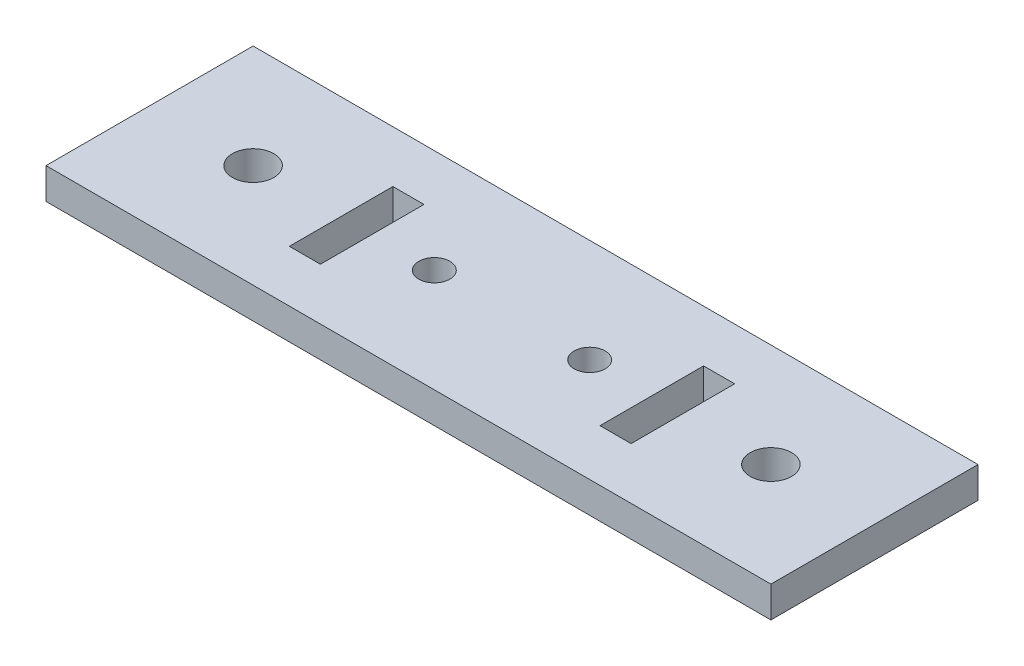
ISO-10303-21;
HEADER;
FILE_DESCRIPTION(('STEP AP214'),'2;1');
FILE_NAME('part.step','',(''),(''),'','','');
FILE_SCHEMA(('AUTOMOTIVE_DESIGN { 1 0 10303 214 1 1 1 1 }'));
ENDSEC;
DATA;
#1=APPLICATION_CONTEXT('core data for automotive mechanical design processes');
#2=APPLICATION_PROTOCOL_DEFINITION('international standard','automotive_design',2000,#1);
#3=PRODUCT_CONTEXT('',#1,'mechanical');
#4=PRODUCT('Part','Part','',(#3));
#5=PRODUCT_RELATED_PRODUCT_CATEGORY('part','',(#4));
#6=PRODUCT_DEFINITION_FORMATION('','',#4);
#7=PRODUCT_DEFINITION_CONTEXT('part definition',#1,'design');
#8=PRODUCT_DEFINITION('design','',#6,#7);
#9=PRODUCT_DEFINITION_SHAPE('','',#8);
#10=(LENGTH_UNIT() NAMED_UNIT(*) SI_UNIT(.MILLI.,.METRE.));
#11=(NAMED_UNIT(*) PLANE_ANGLE_UNIT() SI_UNIT($,.RADIAN.));
#12=(NAMED_UNIT(*) SI_UNIT($,.STERADIAN.) SOLID_ANGLE_UNIT());
#13=UNCERTAINTY_MEASURE_WITH_UNIT(LENGTH_MEASURE(1.E-05),#10,'distance_accuracy_value','');
#14=(GEOMETRIC_REPRESENTATION_CONTEXT(3) GLOBAL_UNCERTAINTY_ASSIGNED_CONTEXT((#13)) GLOBAL_UNIT_ASSIGNED_CONTEXT((#10,
#11,#12)) REPRESENTATION_CONTEXT('',''));
#15=CARTESIAN_POINT('',(0.,0.,0.));
#16=DIRECTION('',(0.,0.,1.));
#17=DIRECTION('',(1.,0.,0.));
#18=AXIS2_PLACEMENT_3D('',#15,#16,#17);
#19=CARTESIAN_POINT('',(0.,3.,0.));
#20=DIRECTION('',(0.,-1.,0.));
#21=DIRECTION('',(0.,0.,-1.));
#22=AXIS2_PLACEMENT_3D('',#19,#20,#21);
#23=PLANE('',#22);
#24=DIRECTION('',(0.,0.,1.));
#25=VECTOR('',#24,1.);
#26=CARTESIAN_POINT('',(18.5,3.,-15.));
#27=LINE('',#26,#25);
#28=CARTESIAN_POINT('',(18.5,3.,-15.));
#29=VERTEX_POINT('',#28);
#30=CARTESIAN_POINT('',(18.5,3.,-5.));
#31=VERTEX_POINT('',#30);
#32=EDGE_CURVE('E186',#29,#31,#27,.T.);
#33=ORIENTED_EDGE('',*,*,#32,.F.);
#34=DIRECTION('',(-1.,0.,0.));
#35=VECTOR('',#34,1.);
#36=CARTESIAN_POINT('',(18.5,3.,-15.));
#37=LINE('',#36,#35);
#38=CARTESIAN_POINT('',(21.5,3.,-15.));
#39=VERTEX_POINT('',#38);
#40=EDGE_CURVE('E197',#39,#29,#37,.T.);
#41=ORIENTED_EDGE('',*,*,#40,.F.);
#42=DIRECTION('',(0.,0.,-1.));
#43=VECTOR('',#42,1.);
#44=CARTESIAN_POINT('',(21.5,3.,-15.));
#45=LINE('',#44,#43);
#46=CARTESIAN_POINT('',(21.5,3.,-5.));
#47=VERTEX_POINT('',#46);
#48=EDGE_CURVE('E193',#47,#39,#45,.T.);
#49=ORIENTED_EDGE('',*,*,#48,.F.);
#50=DIRECTION('',(1.,0.,0.));
#51=VECTOR('',#50,1.);
#52=CARTESIAN_POINT('',(18.5,3.,-5.));
#53=LINE('',#52,#51);
#54=EDGE_CURVE('E189',#31,#47,#53,.T.);
#55=ORIENTED_EDGE('',*,*,#54,.F.);
#56=EDGE_LOOP('',(#33,#41,#49,#55));
#57=FACE_BOUND('',#56,.T.);
#58=DIRECTION('',(0.,0.,1.));
#59=VECTOR('',#58,1.);
#60=CARTESIAN_POINT('',(0.,3.,0.));
#61=LINE('',#60,#59);
#62=CARTESIAN_POINT('',(0.,3.,-20.));
#63=VERTEX_POINT('',#62);
#64=CARTESIAN_POINT('',(0.,3.,0.));
#65=VERTEX_POINT('',#64);
#66=EDGE_CURVE('E229',#63,#65,#61,.T.);
#67=ORIENTED_EDGE('',*,*,#66,.T.);
#68=DIRECTION('',(1.,0.,0.));
#69=VECTOR('',#68,1.);
#70=CARTESIAN_POINT('',(0.,3.,0.));
#71=LINE('',#70,#69);
#72=CARTESIAN_POINT('',(70.,3.,0.));
#73=VERTEX_POINT('',#72);
#74=EDGE_CURVE('E233',#65,#73,#71,.T.);
#75=ORIENTED_EDGE('',*,*,#74,.T.);
#76=DIRECTION('',(0.,0.,-1.));
#77=VECTOR('',#76,1.);
#78=CARTESIAN_POINT('',(70.,3.,0.));
#79=LINE('',#78,#77);
#80=CARTESIAN_POINT('',(70.,3.,-20.));
#81=VERTEX_POINT('',#80);
#82=EDGE_CURVE('E237',#73,#81,#79,.T.);
#83=ORIENTED_EDGE('',*,*,#82,.T.);
#84=DIRECTION('',(-1.,0.,0.));
#85=VECTOR('',#84,1.);
#86=CARTESIAN_POINT('',(0.,3.,-20.));
#87=LINE('',#86,#85);
#88=EDGE_CURVE('E240',#81,#63,#87,.T.);
#89=ORIENTED_EDGE('',*,*,#88,.T.);
#90=EDGE_LOOP('',(#67,#75,#83,#89));
#91=FACE_BOUND('',#90,.T.);
#92=DIRECTION('',(0.,0.,-1.));
#93=VECTOR('',#92,1.);
#94=CARTESIAN_POINT('',(51.5,3.,-15.));
#95=LINE('',#94,#93);
#96=CARTESIAN_POINT('',(51.5,3.,-5.00000000000002));
#97=VERTEX_POINT('',#96);
#98=CARTESIAN_POINT('',(51.5,3.,-15.));
#99=VERTEX_POINT('',#98);
#100=EDGE_CURVE('E135',#97,#99,#95,.T.);
#101=ORIENTED_EDGE('',*,*,#100,.F.);
#102=DIRECTION('',(1.,0.,0.));
#103=VECTOR('',#102,1.);
#104=CARTESIAN_POINT('',(51.5,3.,-5.00000000000002));
#105=LINE('',#104,#103);
#106=CARTESIAN_POINT('',(48.5,3.,-5.00000000000002));
#107=VERTEX_POINT('',#106);
#108=EDGE_CURVE('E162',#107,#97,#105,.T.);
#109=ORIENTED_EDGE('',*,*,#108,.F.);
#110=DIRECTION('',(0.,0.,1.));
#111=VECTOR('',#110,1.);
#112=CARTESIAN_POINT('',(48.5,3.,-15.));
#113=LINE('',#112,#111);
#114=CARTESIAN_POINT('',(48.5,3.,-15.));
#115=VERTEX_POINT('',#114);
#116=EDGE_CURVE('E158',#115,#107,#113,.T.);
#117=ORIENTED_EDGE('',*,*,#116,.F.);
#118=DIRECTION('',(-1.,0.,0.));
#119=VECTOR('',#118,1.);
#120=CARTESIAN_POINT('',(51.5,3.,-15.));
#121=LINE('',#120,#119);
#122=EDGE_CURVE('E144',#99,#115,#121,.T.);
#123=ORIENTED_EDGE('',*,*,#122,.F.);
#124=EDGE_LOOP('',(#101,#109,#117,#123));
#125=FACE_BOUND('',#124,.T.);
#126=CARTESIAN_POINT('',(10.,3.,-10.));
#127=DIRECTION('',(0.,1.,0.));
#128=DIRECTION('',(0.,0.,1.));
#129=AXIS2_PLACEMENT_3D('',#126,#127,#128);
#130=CIRCLE('',#129,2.);
#131=CARTESIAN_POINT('',(10.,3.,-8.));
#132=VERTEX_POINT('',#131);
#133=EDGE_CURVE('E170',#132,#132,#130,.T.);
#134=ORIENTED_EDGE('',*,*,#133,.F.);
#135=EDGE_LOOP('',(#134));
#136=FACE_BOUND('',#135,.T.);
#137=CARTESIAN_POINT('',(27.5,3.,-9.99999999999999));
#138=DIRECTION('',(0.,1.,0.));
#139=DIRECTION('',(0.,0.,1.));
#140=AXIS2_PLACEMENT_3D('',#137,#138,#139);
#141=CIRCLE('',#140,1.5);
#142=CARTESIAN_POINT('',(27.5,3.,-8.49999999999999));
#143=VERTEX_POINT('',#142);
#144=EDGE_CURVE('E383',#143,#143,#141,.T.);
#145=ORIENTED_EDGE('',*,*,#144,.F.);
#146=EDGE_LOOP('',(#145));
#147=FACE_BOUND('',#146,.T.);
#148=CARTESIAN_POINT('',(60.,3.,-10.));
#149=DIRECTION('',(0.,1.,0.));
#150=DIRECTION('',(0.,0.,-1.));
#151=AXIS2_PLACEMENT_3D('',#148,#149,#150);
#152=CIRCLE('',#151,2.);
#153=CARTESIAN_POINT('',(60.,3.,-12.));
#154=VERTEX_POINT('',#153);
#155=EDGE_CURVE('E375',#154,#154,#152,.T.);
#156=ORIENTED_EDGE('',*,*,#155,.F.);
#157=EDGE_LOOP('',(#156));
#158=FACE_BOUND('',#157,.T.);
#159=CARTESIAN_POINT('',(42.5,3.,-10.));
#160=DIRECTION('',(0.,1.,0.));
#161=DIRECTION('',(0.,0.,-1.));
#162=AXIS2_PLACEMENT_3D('',#159,#160,#161);
#163=CIRCLE('',#162,1.5);
#164=CARTESIAN_POINT('',(42.5,3.,-11.5));
#165=VERTEX_POINT('',#164);
#166=EDGE_CURVE('E364',#165,#165,#163,.T.);
#167=ORIENTED_EDGE('',*,*,#166,.F.);
#168=EDGE_LOOP('',(#167));
#169=FACE_BOUND('',#168,.T.);
#170=ADVANCED_FACE('F45',(#57,#91,#125,#136,#147,#158,#169),#23,.F.);
#171=CARTESIAN_POINT('',(0.,0.,0.));
#172=DIRECTION('',(0.,-1.,0.));
#173=DIRECTION('',(0.,0.,-1.));
#174=AXIS2_PLACEMENT_3D('',#171,#172,#173);
#175=PLANE('',#174);
#176=CARTESIAN_POINT('',(60.,0.,-10.));
#177=DIRECTION('',(0.,1.,0.));
#178=DIRECTION('',(0.,0.,-1.));
#179=AXIS2_PLACEMENT_3D('',#176,#177,#178);
#180=CIRCLE('',#179,2.);
#181=CARTESIAN_POINT('',(60.,0.,-12.));
#182=VERTEX_POINT('',#181);
#183=EDGE_CURVE('E372',#182,#182,#180,.T.);
#184=ORIENTED_EDGE('',*,*,#183,.T.);
#185=EDGE_LOOP('',(#184));
#186=FACE_BOUND('',#185,.T.);
#187=CARTESIAN_POINT('',(10.,0.,-10.));
#188=DIRECTION('',(0.,1.,0.));
#189=DIRECTION('',(0.,0.,1.));
#190=AXIS2_PLACEMENT_3D('',#187,#188,#189);
#191=CIRCLE('',#190,2.);
#192=CARTESIAN_POINT('',(10.,0.,-8.));
#193=VERTEX_POINT('',#192);
#194=EDGE_CURVE('E387',#193,#193,#191,.T.);
#195=ORIENTED_EDGE('',*,*,#194,.T.);
#196=EDGE_LOOP('',(#195));
#197=FACE_BOUND('',#196,.T.);
#198=DIRECTION('',(0.,0.,1.));
#199=VECTOR('',#198,1.);
#200=CARTESIAN_POINT('',(0.,0.,0.));
#201=LINE('',#200,#199);
#202=CARTESIAN_POINT('',(0.,0.,-20.));
#203=VERTEX_POINT('',#202);
#204=CARTESIAN_POINT('',(0.,0.,0.));
#205=VERTEX_POINT('',#204);
#206=EDGE_CURVE('E228',#203,#205,#201,.T.);
#207=ORIENTED_EDGE('',*,*,#206,.F.);
#208=DIRECTION('',(-1.,0.,0.));
#209=VECTOR('',#208,1.);
#210=CARTESIAN_POINT('',(0.,0.,-20.));
#211=LINE('',#210,#209);
#212=CARTESIAN_POINT('',(70.,0.,-20.));
#213=VERTEX_POINT('',#212);
#214=EDGE_CURVE('E234',#213,#203,#211,.T.);
#215=ORIENTED_EDGE('',*,*,#214,.F.);
#216=DIRECTION('',(0.,0.,-1.));
#217=VECTOR('',#216,1.);
#218=CARTESIAN_POINT('',(70.,0.,0.));
#219=LINE('',#218,#217);
#220=CARTESIAN_POINT('',(70.,0.,0.));
#221=VERTEX_POINT('',#220);
#222=EDGE_CURVE('E250',#221,#213,#219,.T.);
#223=ORIENTED_EDGE('',*,*,#222,.F.);
#224=DIRECTION('',(1.,0.,0.));
#225=VECTOR('',#224,1.);
#226=CARTESIAN_POINT('',(0.,0.,0.));
#227=LINE('',#226,#225);
#228=EDGE_CURVE('E247',#205,#221,#227,.T.);
#229=ORIENTED_EDGE('',*,*,#228,.F.);
#230=EDGE_LOOP('',(#207,#215,#223,#229));
#231=FACE_BOUND('',#230,.T.);
#232=DIRECTION('',(-1.,0.,0.));
#233=VECTOR('',#232,1.);
#234=CARTESIAN_POINT('',(18.5,0.,-15.));
#235=LINE('',#234,#233);
#236=CARTESIAN_POINT('',(21.5,0.,-15.));
#237=VERTEX_POINT('',#236);
#238=CARTESIAN_POINT('',(18.5,0.,-15.));
#239=VERTEX_POINT('',#238);
#240=EDGE_CURVE('E190',#237,#239,#235,.T.);
#241=ORIENTED_EDGE('',*,*,#240,.T.);
#242=DIRECTION('',(0.,0.,1.));
#243=VECTOR('',#242,1.);
#244=CARTESIAN_POINT('',(18.5,0.,-15.));
#245=LINE('',#244,#243);
#246=CARTESIAN_POINT('',(18.5,0.,-5.));
#247=VERTEX_POINT('',#246);
#248=EDGE_CURVE('E153',#239,#247,#245,.T.);
#249=ORIENTED_EDGE('',*,*,#248,.T.);
#250=DIRECTION('',(1.,0.,0.));
#251=VECTOR('',#250,1.);
#252=CARTESIAN_POINT('',(18.5,0.,-5.));
#253=LINE('',#252,#251);
#254=CARTESIAN_POINT('',(21.5,0.,-5.));
#255=VERTEX_POINT('',#254);
#256=EDGE_CURVE('E204',#247,#255,#253,.T.);
#257=ORIENTED_EDGE('',*,*,#256,.T.);
#258=DIRECTION('',(0.,0.,-1.));
#259=VECTOR('',#258,1.);
#260=CARTESIAN_POINT('',(21.5,0.,-15.));
#261=LINE('',#260,#259);
#262=EDGE_CURVE('E208',#255,#237,#261,.T.);
#263=ORIENTED_EDGE('',*,*,#262,.T.);
#264=EDGE_LOOP('',(#241,#249,#257,#263));
#265=FACE_BOUND('',#264,.T.);
#266=DIRECTION('',(1.,0.,0.));
#267=VECTOR('',#266,1.);
#268=CARTESIAN_POINT('',(51.5,0.,-5.00000000000002));
#269=LINE('',#268,#267);
#270=CARTESIAN_POINT('',(48.5,0.,-5.00000000000002));
#271=VERTEX_POINT('',#270);
#272=CARTESIAN_POINT('',(51.5,0.,-5.00000000000002));
#273=VERTEX_POINT('',#272);
#274=EDGE_CURVE('E145',#271,#273,#269,.T.);
#275=ORIENTED_EDGE('',*,*,#274,.T.);
#276=DIRECTION('',(0.,0.,-1.));
#277=VECTOR('',#276,1.);
#278=CARTESIAN_POINT('',(51.5,0.,-15.));
#279=LINE('',#278,#277);
#280=CARTESIAN_POINT('',(51.5,0.,-15.));
#281=VERTEX_POINT('',#280);
#282=EDGE_CURVE('E69',#273,#281,#279,.T.);
#283=ORIENTED_EDGE('',*,*,#282,.T.);
#284=DIRECTION('',(-1.,0.,0.));
#285=VECTOR('',#284,1.);
#286=CARTESIAN_POINT('',(51.5,0.,-15.));
#287=LINE('',#286,#285);
#288=CARTESIAN_POINT('',(48.5,0.,-15.));
#289=VERTEX_POINT('',#288);
#290=EDGE_CURVE('E151',#281,#289,#287,.T.);
#291=ORIENTED_EDGE('',*,*,#290,.T.);
#292=DIRECTION('',(0.,0.,1.));
#293=VECTOR('',#292,1.);
#294=CARTESIAN_POINT('',(48.5,0.,-15.));
#295=LINE('',#294,#293);
#296=EDGE_CURVE('E173',#289,#271,#295,.T.);
#297=ORIENTED_EDGE('',*,*,#296,.T.);
#298=EDGE_LOOP('',(#275,#283,#291,#297));
#299=FACE_BOUND('',#298,.T.);
#300=CARTESIAN_POINT('',(27.5,0.,-9.99999999999999));
#301=DIRECTION('',(0.,1.,0.));
#302=DIRECTION('',(0.,0.,1.));
#303=AXIS2_PLACEMENT_3D('',#300,#301,#302);
#304=CIRCLE('',#303,1.5);
#305=CARTESIAN_POINT('',(27.5,0.,-8.49999999999999));
#306=VERTEX_POINT('',#305);
#307=EDGE_CURVE('E379',#306,#306,#304,.T.);
#308=ORIENTED_EDGE('',*,*,#307,.T.);
#309=EDGE_LOOP('',(#308));
#310=FACE_BOUND('',#309,.T.);
#311=CARTESIAN_POINT('',(42.5,0.,-10.));
#312=DIRECTION('',(0.,1.,0.));
#313=DIRECTION('',(0.,0.,-1.));
#314=AXIS2_PLACEMENT_3D('',#311,#312,#313);
#315=CIRCLE('',#314,1.5);
#316=CARTESIAN_POINT('',(42.5,0.,-11.5));
#317=VERTEX_POINT('',#316);
#318=EDGE_CURVE('E367',#317,#317,#315,.T.);
#319=ORIENTED_EDGE('',*,*,#318,.T.);
#320=EDGE_LOOP('',(#319));
#321=FACE_BOUND('',#320,.T.);
#322=ADVANCED_FACE('F273',(#186,#197,#231,#265,#299,#310,#321),#175,.T.);
#323=CARTESIAN_POINT('',(0.,3.,0.));
#324=DIRECTION('',(1.,0.,0.));
#325=DIRECTION('',(0.,0.,-1.));
#326=AXIS2_PLACEMENT_3D('',#323,#324,#325);
#327=PLANE('',#326);
#328=ORIENTED_EDGE('',*,*,#206,.T.);
#329=DIRECTION('',(0.,-1.,0.));
#330=VECTOR('',#329,1.);
#331=CARTESIAN_POINT('',(0.,3.,0.));
#332=LINE('',#331,#330);
#333=EDGE_CURVE('E11',#65,#205,#332,.T.);
#334=ORIENTED_EDGE('',*,*,#333,.F.);
#335=ORIENTED_EDGE('',*,*,#66,.F.);
#336=DIRECTION('',(0.,-1.,0.));
#337=VECTOR('',#336,1.);
#338=CARTESIAN_POINT('',(0.,3.,-20.));
#339=LINE('',#338,#337);
#340=EDGE_CURVE('E243',#63,#203,#339,.T.);
#341=ORIENTED_EDGE('',*,*,#340,.T.);
#342=EDGE_LOOP('',(#328,#334,#335,#341));
#343=FACE_BOUND('',#342,.T.);
#344=ADVANCED_FACE('F47',(#343),#327,.F.);
#345=CARTESIAN_POINT('',(0.,3.,0.));
#346=DIRECTION('',(0.,0.,-1.));
#347=DIRECTION('',(-1.,0.,0.));
#348=AXIS2_PLACEMENT_3D('',#345,#346,#347);
#349=PLANE('',#348);
#350=ORIENTED_EDGE('',*,*,#228,.T.);
#351=DIRECTION('',(0.,-1.,0.));
#352=VECTOR('',#351,1.);
#353=CARTESIAN_POINT('',(70.,3.,0.));
#354=LINE('',#353,#352);
#355=EDGE_CURVE('E54',#73,#221,#354,.T.);
#356=ORIENTED_EDGE('',*,*,#355,.F.);
#357=ORIENTED_EDGE('',*,*,#74,.F.);
#358=ORIENTED_EDGE('',*,*,#333,.T.);
#359=EDGE_LOOP('',(#350,#356,#357,#358));
#360=FACE_BOUND('',#359,.T.);
#361=ADVANCED_FACE('F283',(#360),#349,.F.);
#362=CARTESIAN_POINT('',(70.,3.,0.));
#363=DIRECTION('',(-1.,0.,0.));
#364=DIRECTION('',(0.,0.,1.));
#365=AXIS2_PLACEMENT_3D('',#362,#363,#364);
#366=PLANE('',#365);
#367=ORIENTED_EDGE('',*,*,#222,.T.);
#368=DIRECTION('',(0.,-1.,0.));
#369=VECTOR('',#368,1.);
#370=CARTESIAN_POINT('',(70.,3.,-20.));
#371=LINE('',#370,#369);
#372=EDGE_CURVE('E258',#81,#213,#371,.T.);
#373=ORIENTED_EDGE('',*,*,#372,.F.);
#374=ORIENTED_EDGE('',*,*,#82,.F.);
#375=ORIENTED_EDGE('',*,*,#355,.T.);
#376=EDGE_LOOP('',(#367,#373,#374,#375));
#377=FACE_BOUND('',#376,.T.);
#378=ADVANCED_FACE('F267',(#377),#366,.F.);
#379=CARTESIAN_POINT('',(0.,3.,-20.));
#380=DIRECTION('',(0.,0.,1.));
#381=DIRECTION('',(1.,0.,0.));
#382=AXIS2_PLACEMENT_3D('',#379,#380,#381);
#383=PLANE('',#382);
#384=ORIENTED_EDGE('',*,*,#214,.T.);
#385=ORIENTED_EDGE('',*,*,#340,.F.);
#386=ORIENTED_EDGE('',*,*,#88,.F.);
#387=ORIENTED_EDGE('',*,*,#372,.T.);
#388=EDGE_LOOP('',(#384,#385,#386,#387));
#389=FACE_BOUND('',#388,.T.);
#390=ADVANCED_FACE('F277',(#389),#383,.F.);
#391=CARTESIAN_POINT('',(18.5,3.,-15.));
#392=DIRECTION('',(1.,0.,0.));
#393=DIRECTION('',(0.,0.,-1.));
#394=AXIS2_PLACEMENT_3D('',#391,#392,#393);
#395=PLANE('',#394);
#396=ORIENTED_EDGE('',*,*,#248,.F.);
#397=DIRECTION('',(0.,-1.,0.));
#398=VECTOR('',#397,1.);
#399=CARTESIAN_POINT('',(18.5,3.,-15.));
#400=LINE('',#399,#398);
#401=EDGE_CURVE('E200',#29,#239,#400,.T.);
#402=ORIENTED_EDGE('',*,*,#401,.F.);
#403=ORIENTED_EDGE('',*,*,#32,.T.);
#404=DIRECTION('',(0.,-1.,0.));
#405=VECTOR('',#404,1.);
#406=CARTESIAN_POINT('',(18.5,3.,-5.));
#407=LINE('',#406,#405);
#408=EDGE_CURVE('E224',#31,#247,#407,.T.);
#409=ORIENTED_EDGE('',*,*,#408,.T.);
#410=EDGE_LOOP('',(#396,#402,#403,#409));
#411=FACE_BOUND('',#410,.T.);
#412=ADVANCED_FACE('F300',(#411),#395,.T.);
#413=CARTESIAN_POINT('',(18.5,3.,-5.));
#414=DIRECTION('',(0.,0.,-1.));
#415=DIRECTION('',(-1.,0.,0.));
#416=AXIS2_PLACEMENT_3D('',#413,#414,#415);
#417=PLANE('',#416);
#418=ORIENTED_EDGE('',*,*,#256,.F.);
#419=ORIENTED_EDGE('',*,*,#408,.F.);
#420=ORIENTED_EDGE('',*,*,#54,.T.);
#421=DIRECTION('',(0.,-1.,0.));
#422=VECTOR('',#421,1.);
#423=CARTESIAN_POINT('',(21.5,3.,-5.));
#424=LINE('',#423,#422);
#425=EDGE_CURVE('E221',#47,#255,#424,.T.);
#426=ORIENTED_EDGE('',*,*,#425,.T.);
#427=EDGE_LOOP('',(#418,#419,#420,#426));
#428=FACE_BOUND('',#427,.T.);
#429=ADVANCED_FACE('F307',(#428),#417,.T.);
#430=CARTESIAN_POINT('',(21.5,3.,-15.));
#431=DIRECTION('',(-1.,0.,0.));
#432=DIRECTION('',(0.,0.,1.));
#433=AXIS2_PLACEMENT_3D('',#430,#431,#432);
#434=PLANE('',#433);
#435=ORIENTED_EDGE('',*,*,#262,.F.);
#436=ORIENTED_EDGE('',*,*,#425,.F.);
#437=ORIENTED_EDGE('',*,*,#48,.T.);
#438=DIRECTION('',(0.,-1.,0.));
#439=VECTOR('',#438,1.);
#440=CARTESIAN_POINT('',(21.5,3.,-15.));
#441=LINE('',#440,#439);
#442=EDGE_CURVE('E218',#39,#237,#441,.T.);
#443=ORIENTED_EDGE('',*,*,#442,.T.);
#444=EDGE_LOOP('',(#435,#436,#437,#443));
#445=FACE_BOUND('',#444,.T.);
#446=ADVANCED_FACE('F312',(#445),#434,.T.);
#447=CARTESIAN_POINT('',(18.5,3.,-15.));
#448=DIRECTION('',(0.,0.,1.));
#449=DIRECTION('',(1.,0.,0.));
#450=AXIS2_PLACEMENT_3D('',#447,#448,#449);
#451=PLANE('',#450);
#452=ORIENTED_EDGE('',*,*,#240,.F.);
#453=ORIENTED_EDGE('',*,*,#442,.F.);
#454=ORIENTED_EDGE('',*,*,#40,.T.);
#455=ORIENTED_EDGE('',*,*,#401,.T.);
#456=EDGE_LOOP('',(#452,#453,#454,#455));
#457=FACE_BOUND('',#456,.T.);
#458=ADVANCED_FACE('F318',(#457),#451,.T.);
#459=CARTESIAN_POINT('',(51.5,3.,-15.));
#460=DIRECTION('',(-1.,0.,0.));
#461=DIRECTION('',(0.,0.,1.));
#462=AXIS2_PLACEMENT_3D('',#459,#460,#461);
#463=PLANE('',#462);
#464=ORIENTED_EDGE('',*,*,#282,.F.);
#465=DIRECTION('',(0.,-1.,0.));
#466=VECTOR('',#465,1.);
#467=CARTESIAN_POINT('',(51.5,3.,-5.00000000000002));
#468=LINE('',#467,#466);
#469=EDGE_CURVE('E139',#97,#273,#468,.T.);
#470=ORIENTED_EDGE('',*,*,#469,.F.);
#471=ORIENTED_EDGE('',*,*,#100,.T.);
#472=DIRECTION('',(0.,-1.,0.));
#473=VECTOR('',#472,1.);
#474=CARTESIAN_POINT('',(51.5,3.,-15.));
#475=LINE('',#474,#473);
#476=EDGE_CURVE('E138',#99,#281,#475,.T.);
#477=ORIENTED_EDGE('',*,*,#476,.T.);
#478=EDGE_LOOP('',(#464,#470,#471,#477));
#479=FACE_BOUND('',#478,.T.);
#480=ADVANCED_FACE('F137',(#479),#463,.T.);
#481=CARTESIAN_POINT('',(51.5,3.,-15.));
#482=DIRECTION('',(0.,0.,1.));
#483=DIRECTION('',(1.,0.,0.));
#484=AXIS2_PLACEMENT_3D('',#481,#482,#483);
#485=PLANE('',#484);
#486=ORIENTED_EDGE('',*,*,#290,.F.);
#487=ORIENTED_EDGE('',*,*,#476,.F.);
#488=ORIENTED_EDGE('',*,*,#122,.T.);
#489=DIRECTION('',(0.,-1.,0.));
#490=VECTOR('',#489,1.);
#491=CARTESIAN_POINT('',(48.5,3.,-15.));
#492=LINE('',#491,#490);
#493=EDGE_CURVE('E154',#115,#289,#492,.T.);
#494=ORIENTED_EDGE('',*,*,#493,.T.);
#495=EDGE_LOOP('',(#486,#487,#488,#494));
#496=FACE_BOUND('',#495,.T.);
#497=ADVANCED_FACE('F148',(#496),#485,.T.);
#498=CARTESIAN_POINT('',(48.5,3.,-15.));
#499=DIRECTION('',(1.,0.,0.));
#500=DIRECTION('',(0.,0.,-1.));
#501=AXIS2_PLACEMENT_3D('',#498,#499,#500);
#502=PLANE('',#501);
#503=ORIENTED_EDGE('',*,*,#296,.F.);
#504=ORIENTED_EDGE('',*,*,#493,.F.);
#505=ORIENTED_EDGE('',*,*,#116,.T.);
#506=DIRECTION('',(0.,-1.,0.));
#507=VECTOR('',#506,1.);
#508=CARTESIAN_POINT('',(48.5,3.,-5.00000000000002));
#509=LINE('',#508,#507);
#510=EDGE_CURVE('E61',#107,#271,#509,.T.);
#511=ORIENTED_EDGE('',*,*,#510,.T.);
#512=EDGE_LOOP('',(#503,#504,#505,#511));
#513=FACE_BOUND('',#512,.T.);
#514=ADVANCED_FACE('F337',(#513),#502,.T.);
#515=CARTESIAN_POINT('',(51.5,3.,-5.00000000000002));
#516=DIRECTION('',(0.,0.,-1.));
#517=DIRECTION('',(-1.,0.,0.));
#518=AXIS2_PLACEMENT_3D('',#515,#516,#517);
#519=PLANE('',#518);
#520=ORIENTED_EDGE('',*,*,#274,.F.);
#521=ORIENTED_EDGE('',*,*,#510,.F.);
#522=ORIENTED_EDGE('',*,*,#108,.T.);
#523=ORIENTED_EDGE('',*,*,#469,.T.);
#524=EDGE_LOOP('',(#520,#521,#522,#523));
#525=FACE_BOUND('',#524,.T.);
#526=ADVANCED_FACE('F340',(#525),#519,.T.);
#527=CARTESIAN_POINT('',(10.,3.,-10.));
#528=DIRECTION('',(0.,-1.,0.));
#529=DIRECTION('',(0.,0.,-1.));
#530=AXIS2_PLACEMENT_3D('',#527,#528,#529);
#531=CYLINDRICAL_SURFACE('',#530,2.);
#532=ORIENTED_EDGE('',*,*,#133,.T.);
#533=EDGE_LOOP('',(#532));
#534=FACE_BOUND('',#533,.T.);
#535=ORIENTED_EDGE('',*,*,#194,.F.);
#536=EDGE_LOOP('',(#535));
#537=FACE_BOUND('',#536,.T.);
#538=ADVANCED_FACE('F344',(#534,#537),#531,.F.);
#539=CARTESIAN_POINT('',(27.5,3.,-9.99999999999999));
#540=DIRECTION('',(0.,-1.,0.));
#541=DIRECTION('',(0.,0.,-1.));
#542=AXIS2_PLACEMENT_3D('',#539,#540,#541);
#543=CYLINDRICAL_SURFACE('',#542,1.5);
#544=ORIENTED_EDGE('',*,*,#144,.T.);
#545=EDGE_LOOP('',(#544));
#546=FACE_BOUND('',#545,.T.);
#547=ORIENTED_EDGE('',*,*,#307,.F.);
#548=EDGE_LOOP('',(#547));
#549=FACE_BOUND('',#548,.T.);
#550=ADVANCED_FACE('F347',(#546,#549),#543,.F.);
#551=CARTESIAN_POINT('',(60.,3.,-10.));
#552=DIRECTION('',(0.,-1.,0.));
#553=DIRECTION('',(0.,0.,-1.));
#554=AXIS2_PLACEMENT_3D('',#551,#552,#553);
#555=CYLINDRICAL_SURFACE('',#554,2.);
#556=ORIENTED_EDGE('',*,*,#155,.T.);
#557=EDGE_LOOP('',(#556));
#558=FACE_BOUND('',#557,.T.);
#559=ORIENTED_EDGE('',*,*,#183,.F.);
#560=EDGE_LOOP('',(#559));
#561=FACE_BOUND('',#560,.T.);
#562=ADVANCED_FACE('F351',(#558,#561),#555,.F.);
#563=CARTESIAN_POINT('',(42.5,3.,-10.));
#564=DIRECTION('',(0.,-1.,0.));
#565=DIRECTION('',(0.,0.,-1.));
#566=AXIS2_PLACEMENT_3D('',#563,#564,#565);
#567=CYLINDRICAL_SURFACE('',#566,1.5);
#568=ORIENTED_EDGE('',*,*,#166,.T.);
#569=EDGE_LOOP('',(#568));
#570=FACE_BOUND('',#569,.T.);
#571=ORIENTED_EDGE('',*,*,#318,.F.);
#572=EDGE_LOOP('',(#571));
#573=FACE_BOUND('',#572,.T.);
#574=ADVANCED_FACE('F355',(#570,#573),#567,.F.);
#575=CLOSED_SHELL('',(#170,#322,#344,#361,#378,#390,#412,#429,#446,#458,#480,#497,#514,#526,
#538,#550,#562,#574));
#576=MANIFOLD_SOLID_BREP('B2',#575);
#577=ADVANCED_BREP_SHAPE_REPRESENTATION('',(#18,#576),#14);
#578=SHAPE_DEFINITION_REPRESENTATION(#9,#577);
ENDSEC;
END-ISO-10303-21;
